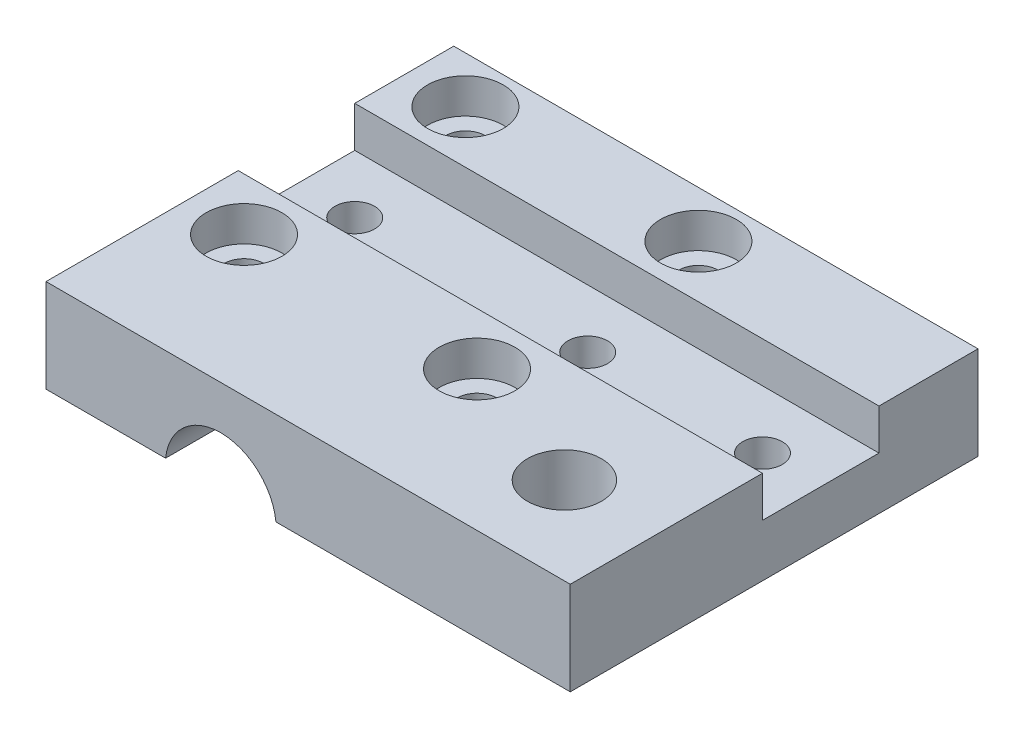
ISO-10303-21;
HEADER;
FILE_DESCRIPTION(('STEP AP214'),'2;1');
FILE_NAME('part.step','',(''),(''),'','','');
FILE_SCHEMA(('AUTOMOTIVE_DESIGN { 1 0 10303 214 1 1 1 1 }'));
ENDSEC;
DATA;
#1=APPLICATION_CONTEXT('core data for automotive mechanical design processes');
#2=APPLICATION_PROTOCOL_DEFINITION('international standard','automotive_design',2000,#1);
#3=PRODUCT_CONTEXT('',#1,'mechanical');
#4=PRODUCT('Part','Part','',(#3));
#5=PRODUCT_RELATED_PRODUCT_CATEGORY('part','',(#4));
#6=PRODUCT_DEFINITION_FORMATION('','',#4);
#7=PRODUCT_DEFINITION_CONTEXT('part definition',#1,'design');
#8=PRODUCT_DEFINITION('design','',#6,#7);
#9=PRODUCT_DEFINITION_SHAPE('','',#8);
#10=(LENGTH_UNIT() NAMED_UNIT(*) SI_UNIT(.MILLI.,.METRE.));
#11=(NAMED_UNIT(*) PLANE_ANGLE_UNIT() SI_UNIT($,.RADIAN.));
#12=(NAMED_UNIT(*) SI_UNIT($,.STERADIAN.) SOLID_ANGLE_UNIT());
#13=UNCERTAINTY_MEASURE_WITH_UNIT(LENGTH_MEASURE(1.E-05),#10,'distance_accuracy_value','');
#14=(GEOMETRIC_REPRESENTATION_CONTEXT(3) GLOBAL_UNCERTAINTY_ASSIGNED_CONTEXT((#13)) GLOBAL_UNIT_ASSIGNED_CONTEXT((#10,
#11,#12)) REPRESENTATION_CONTEXT('',''));
#15=CARTESIAN_POINT('',(0.,0.,0.));
#16=DIRECTION('',(0.,0.,1.));
#17=DIRECTION('',(1.,0.,0.));
#18=AXIS2_PLACEMENT_3D('',#15,#16,#17);
#19=CARTESIAN_POINT('',(25.,5.,-3.99999999999999));
#20=DIRECTION('',(0.,1.,0.));
#21=DIRECTION('',(0.,0.,-1.));
#22=AXIS2_PLACEMENT_3D('',#19,#20,#21);
#23=CYLINDRICAL_SURFACE('',#22,1.69999999999999);
#24=CARTESIAN_POINT('',(25.,5.,-3.99999999999999));
#25=DIRECTION('',(0.,-1.,0.));
#26=DIRECTION('',(0.,0.,-1.));
#27=AXIS2_PLACEMENT_3D('',#24,#25,#26);
#28=CIRCLE('',#27,1.69999999999999);
#29=CARTESIAN_POINT('',(25.,5.,-5.69999999999998));
#30=VERTEX_POINT('',#29);
#31=EDGE_CURVE('E179',#30,#30,#28,.T.);
#32=ORIENTED_EDGE('',*,*,#31,.F.);
#33=EDGE_LOOP('',(#32));
#34=FACE_BOUND('',#33,.T.);
#35=CARTESIAN_POINT('',(25.,1.5,-3.99999999999999));
#36=DIRECTION('',(0.,1.,0.));
#37=DIRECTION('',(0.,0.,1.));
#38=AXIS2_PLACEMENT_3D('',#35,#36,#37);
#39=CIRCLE('',#38,1.69999999999999);
#40=CARTESIAN_POINT('',(25.,1.5,-2.3));
#41=VERTEX_POINT('',#40);
#42=EDGE_CURVE('E36',#41,#41,#39,.F.);
#43=ORIENTED_EDGE('',*,*,#42,.T.);
#44=EDGE_LOOP('',(#43));
#45=FACE_BOUND('',#44,.T.);
#46=ADVANCED_FACE('F32',(#34,#45),#23,.F.);
#47=CARTESIAN_POINT('',(10.,5.,-4.));
#48=DIRECTION('',(0.,1.,0.));
#49=DIRECTION('',(0.,0.,-1.));
#50=AXIS2_PLACEMENT_3D('',#47,#48,#49);
#51=CYLINDRICAL_SURFACE('',#50,1.69999999999999);
#52=CARTESIAN_POINT('',(10.,5.,-4.));
#53=DIRECTION('',(0.,-1.,0.));
#54=DIRECTION('',(0.,0.,-1.));
#55=AXIS2_PLACEMENT_3D('',#52,#53,#54);
#56=CIRCLE('',#55,1.69999999999999);
#57=CARTESIAN_POINT('',(10.,5.,-5.69999999999998));
#58=VERTEX_POINT('',#57);
#59=EDGE_CURVE('E154',#58,#58,#56,.T.);
#60=ORIENTED_EDGE('',*,*,#59,.F.);
#61=EDGE_LOOP('',(#60));
#62=FACE_BOUND('',#61,.T.);
#63=CARTESIAN_POINT('',(10.,1.5,-4.));
#64=DIRECTION('',(0.,1.,0.));
#65=DIRECTION('',(0.,0.,1.));
#66=AXIS2_PLACEMENT_3D('',#63,#64,#65);
#67=CIRCLE('',#66,1.69999999999999);
#68=CARTESIAN_POINT('',(10.,1.5,-2.3));
#69=VERTEX_POINT('',#68);
#70=EDGE_CURVE('E156',#69,#69,#67,.F.);
#71=ORIENTED_EDGE('',*,*,#70,.T.);
#72=EDGE_LOOP('',(#71));
#73=FACE_BOUND('',#72,.T.);
#74=ADVANCED_FACE('F314',(#62,#73),#51,.F.);
#75=CARTESIAN_POINT('',(-10.,5.,-3.99999999999999));
#76=DIRECTION('',(0.,1.,0.));
#77=DIRECTION('',(0.,0.,-1.));
#78=AXIS2_PLACEMENT_3D('',#75,#76,#77);
#79=CYLINDRICAL_SURFACE('',#78,1.69999999999999);
#80=CARTESIAN_POINT('',(-10.,5.,-3.99999999999999));
#81=DIRECTION('',(0.,-1.,0.));
#82=DIRECTION('',(0.,0.,-1.));
#83=AXIS2_PLACEMENT_3D('',#80,#81,#82);
#84=CIRCLE('',#83,1.69999999999999);
#85=CARTESIAN_POINT('',(-10.,5.,-5.69999999999998));
#86=VERTEX_POINT('',#85);
#87=EDGE_CURVE('E182',#86,#86,#84,.T.);
#88=ORIENTED_EDGE('',*,*,#87,.F.);
#89=EDGE_LOOP('',(#88));
#90=FACE_BOUND('',#89,.T.);
#91=CARTESIAN_POINT('',(-10.,1.5,-3.99999999999999));
#92=DIRECTION('',(0.,1.,0.));
#93=DIRECTION('',(0.,0.,1.));
#94=AXIS2_PLACEMENT_3D('',#91,#92,#93);
#95=CIRCLE('',#94,1.69999999999999);
#96=CARTESIAN_POINT('',(-10.,1.5,-2.3));
#97=VERTEX_POINT('',#96);
#98=EDGE_CURVE('E152',#97,#97,#95,.F.);
#99=ORIENTED_EDGE('',*,*,#98,.T.);
#100=EDGE_LOOP('',(#99));
#101=FACE_BOUND('',#100,.T.);
#102=ADVANCED_FACE('F320',(#90,#101),#79,.F.);
#103=CARTESIAN_POINT('',(-15.,8.5,-17.5));
#104=DIRECTION('',(0.,-1.,0.));
#105=DIRECTION('',(0.,0.,1.));
#106=AXIS2_PLACEMENT_3D('',#103,#104,#105);
#107=PLANE('',#106);
#108=CARTESIAN_POINT('',(10.,8.5,5.50000000000001));
#109=DIRECTION('',(0.,-1.,0.));
#110=DIRECTION('',(0.,0.,-1.));
#111=AXIS2_PLACEMENT_3D('',#108,#109,#110);
#112=CIRCLE('',#111,3.25);
#113=CARTESIAN_POINT('',(10.,8.5,2.25000000000001));
#114=VERTEX_POINT('',#113);
#115=EDGE_CURVE('E197',#114,#114,#112,.T.);
#116=ORIENTED_EDGE('',*,*,#115,.T.);
#117=EDGE_LOOP('',(#116));
#118=FACE_BOUND('',#117,.T.);
#119=CARTESIAN_POINT('',(-10.,8.5,5.5));
#120=DIRECTION('',(0.,-1.,0.));
#121=DIRECTION('',(0.,0.,-1.));
#122=AXIS2_PLACEMENT_3D('',#119,#120,#121);
#123=CIRCLE('',#122,3.25);
#124=CARTESIAN_POINT('',(-10.,8.5,2.25000000000001));
#125=VERTEX_POINT('',#124);
#126=EDGE_CURVE('E209',#125,#125,#123,.T.);
#127=ORIENTED_EDGE('',*,*,#126,.T.);
#128=EDGE_LOOP('',(#127));
#129=FACE_BOUND('',#128,.T.);
#130=CARTESIAN_POINT('',(22.,8.5,10.));
#131=DIRECTION('',(0.,-1.,0.));
#132=DIRECTION('',(0.,0.,-1.));
#133=AXIS2_PLACEMENT_3D('',#130,#131,#132);
#134=CIRCLE('',#133,3.175);
#135=CARTESIAN_POINT('',(22.,8.5,6.825));
#136=VERTEX_POINT('',#135);
#137=EDGE_CURVE('E255',#136,#136,#134,.T.);
#138=ORIENTED_EDGE('',*,*,#137,.T.);
#139=EDGE_LOOP('',(#138));
#140=FACE_BOUND('',#139,.T.);
#141=DIRECTION('',(1.,0.,0.));
#142=VECTOR('',#141,1.);
#143=CARTESIAN_POINT('',(-15.,8.5,1.00000000000001));
#144=LINE('',#143,#142);
#145=CARTESIAN_POINT('',(-15.,8.5,1.00000000000001));
#146=VERTEX_POINT('',#145);
#147=CARTESIAN_POINT('',(30.,8.5,1.));
#148=VERTEX_POINT('',#147);
#149=EDGE_CURVE('E238',#146,#148,#144,.T.);
#150=ORIENTED_EDGE('',*,*,#149,.F.);
#151=DIRECTION('',(0.,0.,1.));
#152=VECTOR('',#151,1.);
#153=CARTESIAN_POINT('',(-15.,8.5,-17.5));
#154=LINE('',#153,#152);
#155=CARTESIAN_POINT('',(-15.,8.5,17.5));
#156=VERTEX_POINT('',#155);
#157=EDGE_CURVE('E130',#146,#156,#154,.T.);
#158=ORIENTED_EDGE('',*,*,#157,.T.);
#159=DIRECTION('',(-1.,0.,0.));
#160=VECTOR('',#159,1.);
#161=CARTESIAN_POINT('',(-15.,8.5,17.5));
#162=LINE('',#161,#160);
#163=CARTESIAN_POINT('',(30.,8.5,17.5));
#164=VERTEX_POINT('',#163);
#165=EDGE_CURVE('E142',#164,#156,#162,.T.);
#166=ORIENTED_EDGE('',*,*,#165,.F.);
#167=DIRECTION('',(0.,0.,1.));
#168=VECTOR('',#167,1.);
#169=CARTESIAN_POINT('',(30.,8.5,-17.5));
#170=LINE('',#169,#168);
#171=EDGE_CURVE('E147',#148,#164,#170,.T.);
#172=ORIENTED_EDGE('',*,*,#171,.F.);
#173=EDGE_LOOP('',(#150,#158,#166,#172));
#174=FACE_BOUND('',#173,.T.);
#175=ADVANCED_FACE('F299',(#118,#129,#140,#174),#107,.F.);
#176=CARTESIAN_POINT('',(-15.,0.5,-17.5));
#177=DIRECTION('',(1.,0.,0.));
#178=DIRECTION('',(0.,0.,1.));
#179=AXIS2_PLACEMENT_3D('',#176,#177,#178);
#180=PLANE('',#179);
#181=CARTESIAN_POINT('',(-15.,8.5,-17.5));
#182=VERTEX_POINT('',#181);
#183=CARTESIAN_POINT('',(-15.,8.5,-8.99999999999999));
#184=VERTEX_POINT('',#183);
#185=EDGE_CURVE('E145',#182,#184,#154,.T.);
#186=ORIENTED_EDGE('',*,*,#185,.F.);
#187=DIRECTION('',(0.,-1.,0.));
#188=VECTOR('',#187,1.);
#189=CARTESIAN_POINT('',(-15.,0.5,-17.5));
#190=LINE('',#189,#188);
#191=CARTESIAN_POINT('',(-15.,0.5,-17.5));
#192=VERTEX_POINT('',#191);
#193=EDGE_CURVE('E144',#182,#192,#190,.T.);
#194=ORIENTED_EDGE('',*,*,#193,.T.);
#195=DIRECTION('',(0.,0.,1.));
#196=VECTOR('',#195,1.);
#197=CARTESIAN_POINT('',(-15.,0.5,-17.5));
#198=LINE('',#197,#196);
#199=CARTESIAN_POINT('',(-15.,0.5,17.5));
#200=VERTEX_POINT('',#199);
#201=EDGE_CURVE('E11',#192,#200,#198,.T.);
#202=ORIENTED_EDGE('',*,*,#201,.T.);
#203=DIRECTION('',(0.,-1.,0.));
#204=VECTOR('',#203,1.);
#205=CARTESIAN_POINT('',(-15.,0.5,17.5));
#206=LINE('',#205,#204);
#207=EDGE_CURVE('E85',#156,#200,#206,.T.);
#208=ORIENTED_EDGE('',*,*,#207,.F.);
#209=ORIENTED_EDGE('',*,*,#157,.F.);
#210=DIRECTION('',(0.,1.,0.));
#211=VECTOR('',#210,1.);
#212=CARTESIAN_POINT('',(-15.,5.,1.00000000000001));
#213=LINE('',#212,#211);
#214=CARTESIAN_POINT('',(-15.,5.,1.00000000000001));
#215=VERTEX_POINT('',#214);
#216=EDGE_CURVE('E256',#215,#146,#213,.T.);
#217=ORIENTED_EDGE('',*,*,#216,.F.);
#218=DIRECTION('',(0.,0.,1.));
#219=VECTOR('',#218,1.);
#220=CARTESIAN_POINT('',(-15.,5.,-8.99999999999999));
#221=LINE('',#220,#219);
#222=CARTESIAN_POINT('',(-15.,5.,-8.99999999999999));
#223=VERTEX_POINT('',#222);
#224=EDGE_CURVE('E244',#223,#215,#221,.T.);
#225=ORIENTED_EDGE('',*,*,#224,.F.);
#226=DIRECTION('',(0.,1.,0.));
#227=VECTOR('',#226,1.);
#228=CARTESIAN_POINT('',(-15.,5.,-8.99999999999999));
#229=LINE('',#228,#227);
#230=EDGE_CURVE('E252',#223,#184,#229,.T.);
#231=ORIENTED_EDGE('',*,*,#230,.T.);
#232=EDGE_LOOP('',(#186,#194,#202,#208,#209,#217,#225,#231));
#233=FACE_BOUND('',#232,.T.);
#234=ADVANCED_FACE('F34',(#233),#180,.F.);
#235=CARTESIAN_POINT('',(-15.,0.5,-17.5));
#236=DIRECTION('',(0.,1.,0.));
#237=DIRECTION('',(0.,0.,-1.));
#238=AXIS2_PLACEMENT_3D('',#235,#236,#237);
#239=PLANE('',#238);
#240=CARTESIAN_POINT('',(-10.,0.5,-3.99999999999999));
#241=DIRECTION('',(0.,1.,0.));
#242=DIRECTION('',(0.,0.,1.));
#243=AXIS2_PLACEMENT_3D('',#240,#241,#242);
#244=CIRCLE('',#243,4.);
#245=CARTESIAN_POINT('',(-10.,0.5,0.));
#246=VERTEX_POINT('',#245);
#247=EDGE_CURVE('E158',#246,#246,#244,.T.);
#248=ORIENTED_EDGE('',*,*,#247,.T.);
#249=EDGE_LOOP('',(#248));
#250=FACE_BOUND('',#249,.T.);
#251=CARTESIAN_POINT('',(-10.,0.5,5.5));
#252=DIRECTION('',(0.,-1.,0.));
#253=DIRECTION('',(0.,0.,-1.));
#254=AXIS2_PLACEMENT_3D('',#251,#252,#253);
#255=CIRCLE('',#254,1.7);
#256=CARTESIAN_POINT('',(-10.,0.5,3.8));
#257=VERTEX_POINT('',#256);
#258=EDGE_CURVE('E218',#257,#257,#255,.T.);
#259=ORIENTED_EDGE('',*,*,#258,.F.);
#260=EDGE_LOOP('',(#259));
#261=FACE_BOUND('',#260,.T.);
#262=CARTESIAN_POINT('',(-10.,0.5,-13.5));
#263=DIRECTION('',(0.,-1.,0.));
#264=DIRECTION('',(0.,0.,-1.));
#265=AXIS2_PLACEMENT_3D('',#262,#263,#264);
#266=CIRCLE('',#265,1.7);
#267=CARTESIAN_POINT('',(-10.,0.5,-15.2));
#268=VERTEX_POINT('',#267);
#269=EDGE_CURVE('E230',#268,#268,#266,.T.);
#270=ORIENTED_EDGE('',*,*,#269,.F.);
#271=EDGE_LOOP('',(#270));
#272=FACE_BOUND('',#271,.T.);
#273=DIRECTION('',(1.,0.,0.));
#274=VECTOR('',#273,1.);
#275=CARTESIAN_POINT('',(-15.,0.5,17.5));
#276=LINE('',#275,#274);
#277=CARTESIAN_POINT('',(-4.73618055504644,0.5,17.5));
#278=VERTEX_POINT('',#277);
#279=EDGE_CURVE('E132',#200,#278,#276,.T.);
#280=ORIENTED_EDGE('',*,*,#279,.F.);
#281=ORIENTED_EDGE('',*,*,#201,.F.);
#282=DIRECTION('',(1.,0.,0.));
#283=VECTOR('',#282,1.);
#284=CARTESIAN_POINT('',(-15.,0.5,-17.5));
#285=LINE('',#284,#283);
#286=CARTESIAN_POINT('',(-4.73618055504644,0.5,-17.5));
#287=VERTEX_POINT('',#286);
#288=EDGE_CURVE('E93',#192,#287,#285,.T.);
#289=ORIENTED_EDGE('',*,*,#288,.T.);
#290=DIRECTION('',(0.,0.,1.));
#291=VECTOR('',#290,1.);
#292=CARTESIAN_POINT('',(-4.73618055504644,0.5,-17.5));
#293=LINE('',#292,#291);
#294=EDGE_CURVE('E41',#287,#278,#293,.T.);
#295=ORIENTED_EDGE('',*,*,#294,.T.);
#296=EDGE_LOOP('',(#280,#281,#289,#295));
#297=FACE_BOUND('',#296,.T.);
#298=ADVANCED_FACE('F268',(#250,#261,#272,#297),#239,.F.);
#299=CARTESIAN_POINT('',(0.,0.,-17.5));
#300=DIRECTION('',(0.,0.,1.));
#301=DIRECTION('',(-1.,0.,0.));
#302=AXIS2_PLACEMENT_3D('',#299,#300,#301);
#303=CYLINDRICAL_SURFACE('',#302,4.7625);
#304=CARTESIAN_POINT('',(0.,0.,17.5));
#305=DIRECTION('',(0.,0.,-1.));
#306=DIRECTION('',(1.,0.,0.));
#307=AXIS2_PLACEMENT_3D('',#304,#305,#306);
#308=CIRCLE('',#307,4.7625);
#309=CARTESIAN_POINT('',(4.73618055504644,0.5,17.5));
#310=VERTEX_POINT('',#309);
#311=EDGE_CURVE('E136',#278,#310,#308,.T.);
#312=ORIENTED_EDGE('',*,*,#311,.F.);
#313=ORIENTED_EDGE('',*,*,#294,.F.);
#314=CARTESIAN_POINT('',(0.,0.,-17.5));
#315=DIRECTION('',(0.,0.,-1.));
#316=DIRECTION('',(1.,0.,0.));
#317=AXIS2_PLACEMENT_3D('',#314,#315,#316);
#318=CIRCLE('',#317,4.7625);
#319=CARTESIAN_POINT('',(4.73618055504644,0.5,-17.5));
#320=VERTEX_POINT('',#319);
#321=EDGE_CURVE('E124',#287,#320,#318,.T.);
#322=ORIENTED_EDGE('',*,*,#321,.T.);
#323=DIRECTION('',(0.,0.,1.));
#324=VECTOR('',#323,1.);
#325=CARTESIAN_POINT('',(4.73618055504644,0.5,-17.5));
#326=LINE('',#325,#324);
#327=EDGE_CURVE('E118',#320,#310,#326,.T.);
#328=ORIENTED_EDGE('',*,*,#327,.T.);
#329=EDGE_LOOP('',(#312,#313,#322,#328));
#330=FACE_BOUND('',#329,.T.);
#331=ADVANCED_FACE('F303',(#330),#303,.F.);
#332=CARTESIAN_POINT('',(4.73618055504644,0.5,-17.5));
#333=DIRECTION('',(0.,1.,0.));
#334=DIRECTION('',(0.,0.,-1.));
#335=AXIS2_PLACEMENT_3D('',#332,#333,#334);
#336=PLANE('',#335);
#337=CARTESIAN_POINT('',(25.,0.5,-3.99999999999999));
#338=DIRECTION('',(0.,1.,0.));
#339=DIRECTION('',(0.,0.,1.));
#340=AXIS2_PLACEMENT_3D('',#337,#338,#339);
#341=CIRCLE('',#340,4.);
#342=CARTESIAN_POINT('',(25.,0.5,0.));
#343=VERTEX_POINT('',#342);
#344=EDGE_CURVE('E172',#343,#343,#341,.T.);
#345=ORIENTED_EDGE('',*,*,#344,.T.);
#346=EDGE_LOOP('',(#345));
#347=FACE_BOUND('',#346,.T.);
#348=CARTESIAN_POINT('',(10.,0.5,-4.));
#349=DIRECTION('',(0.,1.,0.));
#350=DIRECTION('',(0.,0.,1.));
#351=AXIS2_PLACEMENT_3D('',#348,#349,#350);
#352=CIRCLE('',#351,4.);
#353=CARTESIAN_POINT('',(10.,0.5,0.));
#354=VERTEX_POINT('',#353);
#355=EDGE_CURVE('E165',#354,#354,#352,.T.);
#356=ORIENTED_EDGE('',*,*,#355,.T.);
#357=EDGE_LOOP('',(#356));
#358=FACE_BOUND('',#357,.T.);
#359=CARTESIAN_POINT('',(10.,0.5,-13.5));
#360=DIRECTION('',(0.,-1.,0.));
#361=DIRECTION('',(0.,0.,-1.));
#362=AXIS2_PLACEMENT_3D('',#359,#360,#361);
#363=CIRCLE('',#362,1.7);
#364=CARTESIAN_POINT('',(10.,0.5,-15.2));
#365=VERTEX_POINT('',#364);
#366=EDGE_CURVE('E194',#365,#365,#363,.T.);
#367=ORIENTED_EDGE('',*,*,#366,.F.);
#368=EDGE_LOOP('',(#367));
#369=FACE_BOUND('',#368,.T.);
#370=CARTESIAN_POINT('',(10.,0.5,5.50000000000001));
#371=DIRECTION('',(0.,-1.,0.));
#372=DIRECTION('',(0.,0.,-1.));
#373=AXIS2_PLACEMENT_3D('',#370,#371,#372);
#374=CIRCLE('',#373,1.7);
#375=CARTESIAN_POINT('',(10.,0.5,3.80000000000001));
#376=VERTEX_POINT('',#375);
#377=EDGE_CURVE('E206',#376,#376,#374,.T.);
#378=ORIENTED_EDGE('',*,*,#377,.F.);
#379=EDGE_LOOP('',(#378));
#380=FACE_BOUND('',#379,.T.);
#381=CARTESIAN_POINT('',(22.,0.5,10.));
#382=DIRECTION('',(0.,-1.,0.));
#383=DIRECTION('',(0.,0.,-1.));
#384=AXIS2_PLACEMENT_3D('',#381,#382,#383);
#385=CIRCLE('',#384,3.175);
#386=CARTESIAN_POINT('',(22.,0.5,6.825));
#387=VERTEX_POINT('',#386);
#388=EDGE_CURVE('E133',#387,#387,#385,.F.);
#389=ORIENTED_EDGE('',*,*,#388,.T.);
#390=EDGE_LOOP('',(#389));
#391=FACE_BOUND('',#390,.T.);
#392=DIRECTION('',(1.,0.,0.));
#393=VECTOR('',#392,1.);
#394=CARTESIAN_POINT('',(4.73618055504644,0.5,17.5));
#395=LINE('',#394,#393);
#396=CARTESIAN_POINT('',(30.,0.5,17.5));
#397=VERTEX_POINT('',#396);
#398=EDGE_CURVE('E139',#310,#397,#395,.T.);
#399=ORIENTED_EDGE('',*,*,#398,.F.);
#400=ORIENTED_EDGE('',*,*,#327,.F.);
#401=DIRECTION('',(1.,0.,0.));
#402=VECTOR('',#401,1.);
#403=CARTESIAN_POINT('',(4.73618055504644,0.5,-17.5));
#404=LINE('',#403,#402);
#405=CARTESIAN_POINT('',(30.,0.5,-17.5));
#406=VERTEX_POINT('',#405);
#407=EDGE_CURVE('E108',#320,#406,#404,.T.);
#408=ORIENTED_EDGE('',*,*,#407,.T.);
#409=DIRECTION('',(0.,0.,1.));
#410=VECTOR('',#409,1.);
#411=CARTESIAN_POINT('',(30.,0.5,-17.5));
#412=LINE('',#411,#410);
#413=EDGE_CURVE('E113',#406,#397,#412,.T.);
#414=ORIENTED_EDGE('',*,*,#413,.T.);
#415=EDGE_LOOP('',(#399,#400,#408,#414));
#416=FACE_BOUND('',#415,.T.);
#417=ADVANCED_FACE('F121',(#347,#358,#369,#380,#391,#416),#336,.F.);
#418=CARTESIAN_POINT('',(30.,5.5,-17.5));
#419=DIRECTION('',(-1.,0.,0.));
#420=DIRECTION('',(0.,0.,-1.));
#421=AXIS2_PLACEMENT_3D('',#418,#419,#420);
#422=PLANE('',#421);
#423=DIRECTION('',(0.,0.,-1.));
#424=VECTOR('',#423,1.);
#425=CARTESIAN_POINT('',(30.,5.,1.00000000000001));
#426=LINE('',#425,#424);
#427=CARTESIAN_POINT('',(30.,5.,1.00000000000001));
#428=VERTEX_POINT('',#427);
#429=CARTESIAN_POINT('',(30.,5.,-8.99999999999999));
#430=VERTEX_POINT('',#429);
#431=EDGE_CURVE('E237',#428,#430,#426,.T.);
#432=ORIENTED_EDGE('',*,*,#431,.F.);
#433=DIRECTION('',(0.,1.,0.));
#434=VECTOR('',#433,1.);
#435=CARTESIAN_POINT('',(30.,5.,1.00000000000001));
#436=LINE('',#435,#434);
#437=EDGE_CURVE('E49',#428,#148,#436,.T.);
#438=ORIENTED_EDGE('',*,*,#437,.T.);
#439=ORIENTED_EDGE('',*,*,#171,.T.);
#440=DIRECTION('',(0.,1.,0.));
#441=VECTOR('',#440,1.);
#442=CARTESIAN_POINT('',(30.,5.5,17.5));
#443=LINE('',#442,#441);
#444=EDGE_CURVE('E115',#397,#164,#443,.T.);
#445=ORIENTED_EDGE('',*,*,#444,.F.);
#446=ORIENTED_EDGE('',*,*,#413,.F.);
#447=DIRECTION('',(0.,1.,0.));
#448=VECTOR('',#447,1.);
#449=CARTESIAN_POINT('',(30.,0.5,-17.5));
#450=LINE('',#449,#448);
#451=CARTESIAN_POINT('',(30.,8.5,-17.5));
#452=VERTEX_POINT('',#451);
#453=EDGE_CURVE('E104',#406,#452,#450,.T.);
#454=ORIENTED_EDGE('',*,*,#453,.T.);
#455=CARTESIAN_POINT('',(30.,8.5,-8.99999999999999));
#456=VERTEX_POINT('',#455);
#457=EDGE_CURVE('E119',#452,#456,#170,.T.);
#458=ORIENTED_EDGE('',*,*,#457,.T.);
#459=DIRECTION('',(0.,1.,0.));
#460=VECTOR('',#459,1.);
#461=CARTESIAN_POINT('',(30.,5.,-8.99999999999999));
#462=LINE('',#461,#460);
#463=EDGE_CURVE('E247',#430,#456,#462,.T.);
#464=ORIENTED_EDGE('',*,*,#463,.F.);
#465=EDGE_LOOP('',(#432,#438,#439,#445,#446,#454,#458,#464));
#466=FACE_BOUND('',#465,.T.);
#467=ADVANCED_FACE('F114',(#466),#422,.F.);
#468=CARTESIAN_POINT('',(10.,8.5,-13.5));
#469=DIRECTION('',(0.,-1.,0.));
#470=DIRECTION('',(0.,0.,-1.));
#471=AXIS2_PLACEMENT_3D('',#468,#469,#470);
#472=CIRCLE('',#471,3.25);
#473=CARTESIAN_POINT('',(10.,8.5,-16.75));
#474=VERTEX_POINT('',#473);
#475=EDGE_CURVE('E185',#474,#474,#472,.T.);
#476=ORIENTED_EDGE('',*,*,#475,.T.);
#477=EDGE_LOOP('',(#476));
#478=FACE_BOUND('',#477,.T.);
#479=CARTESIAN_POINT('',(-10.,8.5,-13.5));
#480=DIRECTION('',(0.,-1.,0.));
#481=DIRECTION('',(0.,0.,-1.));
#482=AXIS2_PLACEMENT_3D('',#479,#480,#481);
#483=CIRCLE('',#482,3.25);
#484=CARTESIAN_POINT('',(-10.,8.5,-16.75));
#485=VERTEX_POINT('',#484);
#486=EDGE_CURVE('E221',#485,#485,#483,.T.);
#487=ORIENTED_EDGE('',*,*,#486,.T.);
#488=EDGE_LOOP('',(#487));
#489=FACE_BOUND('',#488,.T.);
#490=ORIENTED_EDGE('',*,*,#457,.F.);
#491=DIRECTION('',(-1.,0.,0.));
#492=VECTOR('',#491,1.);
#493=CARTESIAN_POINT('',(-15.,8.5,-17.5));
#494=LINE('',#493,#492);
#495=EDGE_CURVE('E58',#452,#182,#494,.T.);
#496=ORIENTED_EDGE('',*,*,#495,.T.);
#497=ORIENTED_EDGE('',*,*,#185,.T.);
#498=DIRECTION('',(1.,0.,0.));
#499=VECTOR('',#498,1.);
#500=CARTESIAN_POINT('',(-15.,8.5,-8.99999999999999));
#501=LINE('',#500,#499);
#502=EDGE_CURVE('E233',#184,#456,#501,.T.);
#503=ORIENTED_EDGE('',*,*,#502,.T.);
#504=EDGE_LOOP('',(#490,#496,#497,#503));
#505=FACE_BOUND('',#504,.T.);
#506=ADVANCED_FACE('F273',(#478,#489,#505),#107,.F.);
#507=CARTESIAN_POINT('',(0.,0.,-17.5));
#508=DIRECTION('',(0.,0.,-1.));
#509=DIRECTION('',(1.,0.,0.));
#510=AXIS2_PLACEMENT_3D('',#507,#508,#509);
#511=PLANE('',#510);
#512=ORIENTED_EDGE('',*,*,#193,.F.);
#513=ORIENTED_EDGE('',*,*,#495,.F.);
#514=ORIENTED_EDGE('',*,*,#453,.F.);
#515=ORIENTED_EDGE('',*,*,#407,.F.);
#516=ORIENTED_EDGE('',*,*,#321,.F.);
#517=ORIENTED_EDGE('',*,*,#288,.F.);
#518=EDGE_LOOP('',(#512,#513,#514,#515,#516,#517));
#519=FACE_BOUND('',#518,.T.);
#520=ADVANCED_FACE('F106',(#519),#511,.T.);
#521=CARTESIAN_POINT('',(0.,0.,17.5));
#522=DIRECTION('',(0.,0.,-1.));
#523=DIRECTION('',(1.,0.,0.));
#524=AXIS2_PLACEMENT_3D('',#521,#522,#523);
#525=PLANE('',#524);
#526=ORIENTED_EDGE('',*,*,#207,.T.);
#527=ORIENTED_EDGE('',*,*,#279,.T.);
#528=ORIENTED_EDGE('',*,*,#311,.T.);
#529=ORIENTED_EDGE('',*,*,#398,.T.);
#530=ORIENTED_EDGE('',*,*,#444,.T.);
#531=ORIENTED_EDGE('',*,*,#165,.T.);
#532=EDGE_LOOP('',(#526,#527,#528,#529,#530,#531));
#533=FACE_BOUND('',#532,.T.);
#534=ADVANCED_FACE('F301',(#533),#525,.F.);
#535=CARTESIAN_POINT('',(22.,0.498999999999999,10.));
#536=DIRECTION('',(0.,1.,0.));
#537=DIRECTION('',(0.,0.,-1.));
#538=AXIS2_PLACEMENT_3D('',#535,#536,#537);
#539=CYLINDRICAL_SURFACE('',#538,3.175);
#540=ORIENTED_EDGE('',*,*,#137,.F.);
#541=EDGE_LOOP('',(#540));
#542=FACE_BOUND('',#541,.T.);
#543=ORIENTED_EDGE('',*,*,#388,.F.);
#544=EDGE_LOOP('',(#543));
#545=FACE_BOUND('',#544,.T.);
#546=ADVANCED_FACE('F386',(#542,#545),#539,.F.);
#547=CARTESIAN_POINT('',(-15.,5.,-8.99999999999999));
#548=DIRECTION('',(0.,0.,-1.));
#549=DIRECTION('',(1.,0.,0.));
#550=AXIS2_PLACEMENT_3D('',#547,#548,#549);
#551=PLANE('',#550);
#552=ORIENTED_EDGE('',*,*,#502,.F.);
#553=ORIENTED_EDGE('',*,*,#230,.F.);
#554=DIRECTION('',(1.,0.,0.));
#555=VECTOR('',#554,1.);
#556=CARTESIAN_POINT('',(-15.,5.,-8.99999999999999));
#557=LINE('',#556,#555);
#558=EDGE_CURVE('E234',#223,#430,#557,.T.);
#559=ORIENTED_EDGE('',*,*,#558,.T.);
#560=ORIENTED_EDGE('',*,*,#463,.T.);
#561=EDGE_LOOP('',(#552,#553,#559,#560));
#562=FACE_BOUND('',#561,.T.);
#563=ADVANCED_FACE('F295',(#562),#551,.F.);
#564=CARTESIAN_POINT('',(-15.,5.,1.00000000000001));
#565=DIRECTION('',(0.,0.,-1.));
#566=DIRECTION('',(1.,0.,0.));
#567=AXIS2_PLACEMENT_3D('',#564,#565,#566);
#568=PLANE('',#567);
#569=ORIENTED_EDGE('',*,*,#149,.T.);
#570=ORIENTED_EDGE('',*,*,#437,.F.);
#571=DIRECTION('',(1.,0.,0.));
#572=VECTOR('',#571,1.);
#573=CARTESIAN_POINT('',(-15.,5.,1.00000000000001));
#574=LINE('',#573,#572);
#575=EDGE_CURVE('E241',#215,#428,#574,.T.);
#576=ORIENTED_EDGE('',*,*,#575,.F.);
#577=ORIENTED_EDGE('',*,*,#216,.T.);
#578=EDGE_LOOP('',(#569,#570,#576,#577));
#579=FACE_BOUND('',#578,.T.);
#580=ADVANCED_FACE('F292',(#579),#568,.T.);
#581=CARTESIAN_POINT('',(30.,5.,-8.99999999999999));
#582=DIRECTION('',(0.,-1.,0.));
#583=DIRECTION('',(0.,0.,1.));
#584=AXIS2_PLACEMENT_3D('',#581,#582,#583);
#585=PLANE('',#584);
#586=ORIENTED_EDGE('',*,*,#59,.T.);
#587=EDGE_LOOP('',(#586));
#588=FACE_BOUND('',#587,.T.);
#589=ORIENTED_EDGE('',*,*,#31,.T.);
#590=EDGE_LOOP('',(#589));
#591=FACE_BOUND('',#590,.T.);
#592=ORIENTED_EDGE('',*,*,#87,.T.);
#593=EDGE_LOOP('',(#592));
#594=FACE_BOUND('',#593,.T.);
#595=ORIENTED_EDGE('',*,*,#558,.F.);
#596=ORIENTED_EDGE('',*,*,#224,.T.);
#597=ORIENTED_EDGE('',*,*,#575,.T.);
#598=ORIENTED_EDGE('',*,*,#431,.T.);
#599=EDGE_LOOP('',(#595,#596,#597,#598));
#600=FACE_BOUND('',#599,.T.);
#601=ADVANCED_FACE('F291',(#588,#591,#594,#600),#585,.F.);
#602=CARTESIAN_POINT('',(-10.,8.5,-13.5));
#603=DIRECTION('',(0.,1.,0.));
#604=DIRECTION('',(0.,0.,-1.));
#605=AXIS2_PLACEMENT_3D('',#602,#603,#604);
#606=CYLINDRICAL_SURFACE('',#605,1.7);
#607=ORIENTED_EDGE('',*,*,#269,.T.);
#608=EDGE_LOOP('',(#607));
#609=FACE_BOUND('',#608,.T.);
#610=CARTESIAN_POINT('',(-10.,5.5,-13.5));
#611=DIRECTION('',(0.,-1.,0.));
#612=DIRECTION('',(0.,0.,-1.));
#613=AXIS2_PLACEMENT_3D('',#610,#611,#612);
#614=CIRCLE('',#613,1.7);
#615=CARTESIAN_POINT('',(-10.,5.5,-15.2));
#616=VERTEX_POINT('',#615);
#617=EDGE_CURVE('E227',#616,#616,#614,.T.);
#618=ORIENTED_EDGE('',*,*,#617,.F.);
#619=EDGE_LOOP('',(#618));
#620=FACE_BOUND('',#619,.T.);
#621=ADVANCED_FACE('F374',(#609,#620),#606,.F.);
#622=CARTESIAN_POINT('',(-8.3,5.5,-13.5));
#623=DIRECTION('',(0.,-1.,0.));
#624=DIRECTION('',(0.,0.,1.));
#625=AXIS2_PLACEMENT_3D('',#622,#623,#624);
#626=PLANE('',#625);
#627=ORIENTED_EDGE('',*,*,#617,.T.);
#628=EDGE_LOOP('',(#627));
#629=FACE_BOUND('',#628,.T.);
#630=CARTESIAN_POINT('',(-10.,5.5,-13.5));
#631=DIRECTION('',(0.,-1.,0.));
#632=DIRECTION('',(0.,0.,-1.));
#633=AXIS2_PLACEMENT_3D('',#630,#631,#632);
#634=CIRCLE('',#633,3.25);
#635=CARTESIAN_POINT('',(-10.,5.5,-16.75));
#636=VERTEX_POINT('',#635);
#637=EDGE_CURVE('E224',#636,#636,#634,.T.);
#638=ORIENTED_EDGE('',*,*,#637,.F.);
#639=EDGE_LOOP('',(#638));
#640=FACE_BOUND('',#639,.T.);
#641=ADVANCED_FACE('F370',(#629,#640),#626,.F.);
#642=CARTESIAN_POINT('',(-10.,8.5,-13.5));
#643=DIRECTION('',(0.,1.,0.));
#644=DIRECTION('',(0.,0.,-1.));
#645=AXIS2_PLACEMENT_3D('',#642,#643,#644);
#646=CYLINDRICAL_SURFACE('',#645,3.25);
#647=ORIENTED_EDGE('',*,*,#637,.T.);
#648=EDGE_LOOP('',(#647));
#649=FACE_BOUND('',#648,.T.);
#650=ORIENTED_EDGE('',*,*,#486,.F.);
#651=EDGE_LOOP('',(#650));
#652=FACE_BOUND('',#651,.T.);
#653=ADVANCED_FACE('F366',(#649,#652),#646,.F.);
#654=CARTESIAN_POINT('',(-10.,8.5,5.5));
#655=DIRECTION('',(0.,1.,0.));
#656=DIRECTION('',(0.,0.,-1.));
#657=AXIS2_PLACEMENT_3D('',#654,#655,#656);
#658=CYLINDRICAL_SURFACE('',#657,1.7);
#659=ORIENTED_EDGE('',*,*,#258,.T.);
#660=EDGE_LOOP('',(#659));
#661=FACE_BOUND('',#660,.T.);
#662=CARTESIAN_POINT('',(-10.,5.5,5.5));
#663=DIRECTION('',(0.,-1.,0.));
#664=DIRECTION('',(0.,0.,-1.));
#665=AXIS2_PLACEMENT_3D('',#662,#663,#664);
#666=CIRCLE('',#665,1.7);
#667=CARTESIAN_POINT('',(-10.,5.5,3.8));
#668=VERTEX_POINT('',#667);
#669=EDGE_CURVE('E215',#668,#668,#666,.T.);
#670=ORIENTED_EDGE('',*,*,#669,.F.);
#671=EDGE_LOOP('',(#670));
#672=FACE_BOUND('',#671,.T.);
#673=ADVANCED_FACE('F362',(#661,#672),#658,.F.);
#674=CARTESIAN_POINT('',(-8.3,5.5,5.5));
#675=DIRECTION('',(0.,-1.,0.));
#676=DIRECTION('',(0.,0.,1.));
#677=AXIS2_PLACEMENT_3D('',#674,#675,#676);
#678=PLANE('',#677);
#679=ORIENTED_EDGE('',*,*,#669,.T.);
#680=EDGE_LOOP('',(#679));
#681=FACE_BOUND('',#680,.T.);
#682=CARTESIAN_POINT('',(-10.,5.5,5.5));
#683=DIRECTION('',(0.,-1.,0.));
#684=DIRECTION('',(0.,0.,-1.));
#685=AXIS2_PLACEMENT_3D('',#682,#683,#684);
#686=CIRCLE('',#685,3.25);
#687=CARTESIAN_POINT('',(-10.,5.5,2.25000000000001));
#688=VERTEX_POINT('',#687);
#689=EDGE_CURVE('E212',#688,#688,#686,.T.);
#690=ORIENTED_EDGE('',*,*,#689,.F.);
#691=EDGE_LOOP('',(#690));
#692=FACE_BOUND('',#691,.T.);
#693=ADVANCED_FACE('F358',(#681,#692),#678,.F.);
#694=CARTESIAN_POINT('',(-10.,8.5,5.5));
#695=DIRECTION('',(0.,1.,0.));
#696=DIRECTION('',(0.,0.,-1.));
#697=AXIS2_PLACEMENT_3D('',#694,#695,#696);
#698=CYLINDRICAL_SURFACE('',#697,3.25);
#699=ORIENTED_EDGE('',*,*,#689,.T.);
#700=EDGE_LOOP('',(#699));
#701=FACE_BOUND('',#700,.T.);
#702=ORIENTED_EDGE('',*,*,#126,.F.);
#703=EDGE_LOOP('',(#702));
#704=FACE_BOUND('',#703,.T.);
#705=ADVANCED_FACE('F354',(#701,#704),#698,.F.);
#706=CARTESIAN_POINT('',(10.,8.5,5.50000000000001));
#707=DIRECTION('',(0.,1.,0.));
#708=DIRECTION('',(0.,0.,-1.));
#709=AXIS2_PLACEMENT_3D('',#706,#707,#708);
#710=CYLINDRICAL_SURFACE('',#709,1.7);
#711=ORIENTED_EDGE('',*,*,#377,.T.);
#712=EDGE_LOOP('',(#711));
#713=FACE_BOUND('',#712,.T.);
#714=CARTESIAN_POINT('',(10.,5.5,5.50000000000001));
#715=DIRECTION('',(0.,-1.,0.));
#716=DIRECTION('',(0.,0.,-1.));
#717=AXIS2_PLACEMENT_3D('',#714,#715,#716);
#718=CIRCLE('',#717,1.7);
#719=CARTESIAN_POINT('',(10.,5.5,3.8));
#720=VERTEX_POINT('',#719);
#721=EDGE_CURVE('E203',#720,#720,#718,.T.);
#722=ORIENTED_EDGE('',*,*,#721,.F.);
#723=EDGE_LOOP('',(#722));
#724=FACE_BOUND('',#723,.T.);
#725=ADVANCED_FACE('F350',(#713,#724),#710,.F.);
#726=CARTESIAN_POINT('',(11.7,5.5,5.50000000000001));
#727=DIRECTION('',(0.,-1.,0.));
#728=DIRECTION('',(0.,0.,1.));
#729=AXIS2_PLACEMENT_3D('',#726,#727,#728);
#730=PLANE('',#729);
#731=ORIENTED_EDGE('',*,*,#721,.T.);
#732=EDGE_LOOP('',(#731));
#733=FACE_BOUND('',#732,.T.);
#734=CARTESIAN_POINT('',(10.,5.5,5.50000000000001));
#735=DIRECTION('',(0.,-1.,0.));
#736=DIRECTION('',(0.,0.,-1.));
#737=AXIS2_PLACEMENT_3D('',#734,#735,#736);
#738=CIRCLE('',#737,3.25);
#739=CARTESIAN_POINT('',(10.,5.5,2.25000000000001));
#740=VERTEX_POINT('',#739);
#741=EDGE_CURVE('E200',#740,#740,#738,.T.);
#742=ORIENTED_EDGE('',*,*,#741,.F.);
#743=EDGE_LOOP('',(#742));
#744=FACE_BOUND('',#743,.T.);
#745=ADVANCED_FACE('F346',(#733,#744),#730,.F.);
#746=CARTESIAN_POINT('',(10.,8.5,5.50000000000001));
#747=DIRECTION('',(0.,1.,0.));
#748=DIRECTION('',(0.,0.,-1.));
#749=AXIS2_PLACEMENT_3D('',#746,#747,#748);
#750=CYLINDRICAL_SURFACE('',#749,3.25);
#751=ORIENTED_EDGE('',*,*,#741,.T.);
#752=EDGE_LOOP('',(#751));
#753=FACE_BOUND('',#752,.T.);
#754=ORIENTED_EDGE('',*,*,#115,.F.);
#755=EDGE_LOOP('',(#754));
#756=FACE_BOUND('',#755,.T.);
#757=ADVANCED_FACE('F342',(#753,#756),#750,.F.);
#758=CARTESIAN_POINT('',(10.,8.5,-13.5));
#759=DIRECTION('',(0.,1.,0.));
#760=DIRECTION('',(0.,0.,-1.));
#761=AXIS2_PLACEMENT_3D('',#758,#759,#760);
#762=CYLINDRICAL_SURFACE('',#761,1.7);
#763=ORIENTED_EDGE('',*,*,#366,.T.);
#764=EDGE_LOOP('',(#763));
#765=FACE_BOUND('',#764,.T.);
#766=CARTESIAN_POINT('',(10.,5.5,-13.5));
#767=DIRECTION('',(0.,-1.,0.));
#768=DIRECTION('',(0.,0.,-1.));
#769=AXIS2_PLACEMENT_3D('',#766,#767,#768);
#770=CIRCLE('',#769,1.7);
#771=CARTESIAN_POINT('',(10.,5.5,-15.2));
#772=VERTEX_POINT('',#771);
#773=EDGE_CURVE('E191',#772,#772,#770,.T.);
#774=ORIENTED_EDGE('',*,*,#773,.F.);
#775=EDGE_LOOP('',(#774));
#776=FACE_BOUND('',#775,.T.);
#777=ADVANCED_FACE('F338',(#765,#776),#762,.F.);
#778=CARTESIAN_POINT('',(11.7,5.5,-13.5));
#779=DIRECTION('',(0.,-1.,0.));
#780=DIRECTION('',(0.,0.,1.));
#781=AXIS2_PLACEMENT_3D('',#778,#779,#780);
#782=PLANE('',#781);
#783=ORIENTED_EDGE('',*,*,#773,.T.);
#784=EDGE_LOOP('',(#783));
#785=FACE_BOUND('',#784,.T.);
#786=CARTESIAN_POINT('',(10.,5.5,-13.5));
#787=DIRECTION('',(0.,-1.,0.));
#788=DIRECTION('',(0.,0.,-1.));
#789=AXIS2_PLACEMENT_3D('',#786,#787,#788);
#790=CIRCLE('',#789,3.25);
#791=CARTESIAN_POINT('',(10.,5.5,-16.75));
#792=VERTEX_POINT('',#791);
#793=EDGE_CURVE('E188',#792,#792,#790,.T.);
#794=ORIENTED_EDGE('',*,*,#793,.F.);
#795=EDGE_LOOP('',(#794));
#796=FACE_BOUND('',#795,.T.);
#797=ADVANCED_FACE('F334',(#785,#796),#782,.F.);
#798=CARTESIAN_POINT('',(10.,8.5,-13.5));
#799=DIRECTION('',(0.,1.,0.));
#800=DIRECTION('',(0.,0.,-1.));
#801=AXIS2_PLACEMENT_3D('',#798,#799,#800);
#802=CYLINDRICAL_SURFACE('',#801,3.25);
#803=ORIENTED_EDGE('',*,*,#793,.T.);
#804=EDGE_LOOP('',(#803));
#805=FACE_BOUND('',#804,.T.);
#806=ORIENTED_EDGE('',*,*,#475,.F.);
#807=EDGE_LOOP('',(#806));
#808=FACE_BOUND('',#807,.T.);
#809=ADVANCED_FACE('F330',(#805,#808),#802,.F.);
#810=CARTESIAN_POINT('',(-10.,1.5,-3.99999999999999));
#811=DIRECTION('',(0.,-1.,0.));
#812=DIRECTION('',(0.,0.,1.));
#813=AXIS2_PLACEMENT_3D('',#810,#811,#812);
#814=PLANE('',#813);
#815=CARTESIAN_POINT('',(-10.,1.5,-3.99999999999999));
#816=DIRECTION('',(0.,1.,0.));
#817=DIRECTION('',(0.,0.,1.));
#818=AXIS2_PLACEMENT_3D('',#815,#816,#817);
#819=CIRCLE('',#818,4.);
#820=CARTESIAN_POINT('',(-10.,1.5,0.));
#821=VERTEX_POINT('',#820);
#822=EDGE_CURVE('E155',#821,#821,#819,.T.);
#823=ORIENTED_EDGE('',*,*,#822,.F.);
#824=EDGE_LOOP('',(#823));
#825=FACE_BOUND('',#824,.T.);
#826=ORIENTED_EDGE('',*,*,#98,.F.);
#827=EDGE_LOOP('',(#826));
#828=FACE_BOUND('',#827,.T.);
#829=ADVANCED_FACE('F333',(#825,#828),#814,.T.);
#830=CARTESIAN_POINT('',(-10.,1.5,-3.99999999999999));
#831=DIRECTION('',(0.,-1.,0.));
#832=DIRECTION('',(0.,0.,1.));
#833=AXIS2_PLACEMENT_3D('',#830,#831,#832);
#834=CYLINDRICAL_SURFACE('',#833,4.);
#835=ORIENTED_EDGE('',*,*,#822,.T.);
#836=EDGE_LOOP('',(#835));
#837=FACE_BOUND('',#836,.T.);
#838=ORIENTED_EDGE('',*,*,#247,.F.);
#839=EDGE_LOOP('',(#838));
#840=FACE_BOUND('',#839,.T.);
#841=ADVANCED_FACE('F484',(#837,#840),#834,.F.);
#842=CARTESIAN_POINT('',(10.,1.5,-4.));
#843=DIRECTION('',(0.,-1.,0.));
#844=DIRECTION('',(0.,0.,1.));
#845=AXIS2_PLACEMENT_3D('',#842,#843,#844);
#846=PLANE('',#845);
#847=CARTESIAN_POINT('',(10.,1.5,-4.));
#848=DIRECTION('',(0.,1.,0.));
#849=DIRECTION('',(0.,0.,1.));
#850=AXIS2_PLACEMENT_3D('',#847,#848,#849);
#851=CIRCLE('',#850,4.);
#852=CARTESIAN_POINT('',(10.,1.5,0.));
#853=VERTEX_POINT('',#852);
#854=EDGE_CURVE('E159',#853,#853,#851,.T.);
#855=ORIENTED_EDGE('',*,*,#854,.F.);
#856=EDGE_LOOP('',(#855));
#857=FACE_BOUND('',#856,.T.);
#858=ORIENTED_EDGE('',*,*,#70,.F.);
#859=EDGE_LOOP('',(#858));
#860=FACE_BOUND('',#859,.T.);
#861=ADVANCED_FACE('F492',(#857,#860),#846,.T.);
#862=CARTESIAN_POINT('',(10.,1.5,-4.));
#863=DIRECTION('',(0.,-1.,0.));
#864=DIRECTION('',(0.,0.,1.));
#865=AXIS2_PLACEMENT_3D('',#862,#863,#864);
#866=CYLINDRICAL_SURFACE('',#865,4.);
#867=ORIENTED_EDGE('',*,*,#854,.T.);
#868=EDGE_LOOP('',(#867));
#869=FACE_BOUND('',#868,.T.);
#870=ORIENTED_EDGE('',*,*,#355,.F.);
#871=EDGE_LOOP('',(#870));
#872=FACE_BOUND('',#871,.T.);
#873=ADVANCED_FACE('F499',(#869,#872),#866,.F.);
#874=CARTESIAN_POINT('',(25.,1.5,-3.99999999999999));
#875=DIRECTION('',(0.,-1.,0.));
#876=DIRECTION('',(0.,0.,1.));
#877=AXIS2_PLACEMENT_3D('',#874,#875,#876);
#878=PLANE('',#877);
#879=CARTESIAN_POINT('',(25.,1.5,-3.99999999999999));
#880=DIRECTION('',(0.,1.,0.));
#881=DIRECTION('',(0.,0.,1.));
#882=AXIS2_PLACEMENT_3D('',#879,#880,#881);
#883=CIRCLE('',#882,4.);
#884=CARTESIAN_POINT('',(25.,1.5,0.));
#885=VERTEX_POINT('',#884);
#886=EDGE_CURVE('E638',#885,#885,#883,.T.);
#887=ORIENTED_EDGE('',*,*,#886,.F.);
#888=EDGE_LOOP('',(#887));
#889=FACE_BOUND('',#888,.T.);
#890=ORIENTED_EDGE('',*,*,#42,.F.);
#891=EDGE_LOOP('',(#890));
#892=FACE_BOUND('',#891,.T.);
#893=ADVANCED_FACE('F507',(#889,#892),#878,.T.);
#894=CARTESIAN_POINT('',(25.,1.5,-3.99999999999999));
#895=DIRECTION('',(0.,-1.,0.));
#896=DIRECTION('',(0.,0.,1.));
#897=AXIS2_PLACEMENT_3D('',#894,#895,#896);
#898=CYLINDRICAL_SURFACE('',#897,4.);
#899=ORIENTED_EDGE('',*,*,#886,.T.);
#900=EDGE_LOOP('',(#899));
#901=FACE_BOUND('',#900,.T.);
#902=ORIENTED_EDGE('',*,*,#344,.F.);
#903=EDGE_LOOP('',(#902));
#904=FACE_BOUND('',#903,.T.);
#905=ADVANCED_FACE('F514',(#901,#904),#898,.F.);
#906=CLOSED_SHELL('',(#46,#74,#102,#175,#234,#298,#331,#417,#467,#506,#520,#534,#546,#563,#580,
#601,#621,#641,#653,#673,#693,#705,#725,#745,#757,#777,#797,#809,#829,#841,#861,#873,#893,#905));
#907=MANIFOLD_SOLID_BREP('B2',#906);
#908=ADVANCED_BREP_SHAPE_REPRESENTATION('',(#18,#907),#14);
#909=SHAPE_DEFINITION_REPRESENTATION(#9,#908);
ENDSEC;
END-ISO-10303-21;
